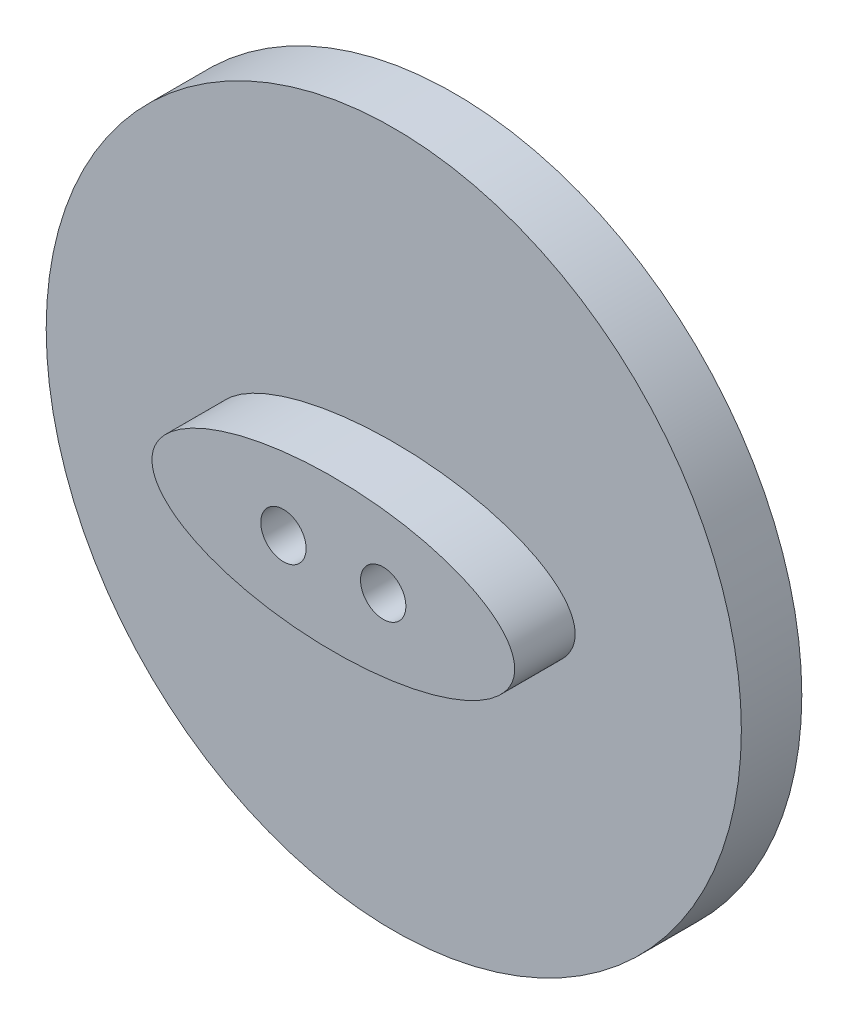
ISO-10303-21;
HEADER;
FILE_DESCRIPTION(('STEP AP214'),'2;1');
FILE_NAME('part.step','',(''),(''),'','','');
FILE_SCHEMA(('AUTOMOTIVE_DESIGN { 1 0 10303 214 1 1 1 1 }'));
ENDSEC;
DATA;
#1=APPLICATION_CONTEXT('core data for automotive mechanical design processes');
#2=APPLICATION_PROTOCOL_DEFINITION('international standard','automotive_design',2000,#1);
#3=PRODUCT_CONTEXT('',#1,'mechanical');
#4=PRODUCT('Part','Part','',(#3));
#5=PRODUCT_RELATED_PRODUCT_CATEGORY('part','',(#4));
#6=PRODUCT_DEFINITION_FORMATION('','',#4);
#7=PRODUCT_DEFINITION_CONTEXT('part definition',#1,'design');
#8=PRODUCT_DEFINITION('design','',#6,#7);
#9=PRODUCT_DEFINITION_SHAPE('','',#8);
#10=(LENGTH_UNIT() NAMED_UNIT(*) SI_UNIT(.MILLI.,.METRE.));
#11=(NAMED_UNIT(*) PLANE_ANGLE_UNIT() SI_UNIT($,.RADIAN.));
#12=(NAMED_UNIT(*) SI_UNIT($,.STERADIAN.) SOLID_ANGLE_UNIT());
#13=UNCERTAINTY_MEASURE_WITH_UNIT(LENGTH_MEASURE(1.E-05),#10,'distance_accuracy_value','');
#14=(GEOMETRIC_REPRESENTATION_CONTEXT(3) GLOBAL_UNCERTAINTY_ASSIGNED_CONTEXT((#13)) GLOBAL_UNIT_ASSIGNED_CONTEXT((#10,
#11,#12)) REPRESENTATION_CONTEXT('',''));
#15=CARTESIAN_POINT('',(0.,0.,0.));
#16=DIRECTION('',(0.,0.,1.));
#17=DIRECTION('',(1.,0.,0.));
#18=AXIS2_PLACEMENT_3D('',#15,#16,#17);
#19=CARTESIAN_POINT('',(0.,0.,2.));
#20=DIRECTION('',(0.,0.,-1.));
#21=DIRECTION('',(-1.,0.,0.));
#22=AXIS2_PLACEMENT_3D('',#19,#20,#21);
#23=CYLINDRICAL_SURFACE('',#22,11.5);
#24=CARTESIAN_POINT('',(0.,0.,2.));
#25=DIRECTION('',(0.,0.,1.));
#26=DIRECTION('',(1.,0.,0.));
#27=AXIS2_PLACEMENT_3D('',#24,#25,#26);
#28=CIRCLE('',#27,11.5);
#29=CARTESIAN_POINT('',(11.5,0.,2.));
#30=VERTEX_POINT('',#29);
#31=EDGE_CURVE('E45',#30,#30,#28,.T.);
#32=ORIENTED_EDGE('',*,*,#31,.F.);
#33=EDGE_LOOP('',(#32));
#34=FACE_BOUND('',#33,.T.);
#35=CARTESIAN_POINT('',(0.,0.,0.));
#36=DIRECTION('',(0.,0.,1.));
#37=DIRECTION('',(1.,0.,0.));
#38=AXIS2_PLACEMENT_3D('',#35,#36,#37);
#39=CIRCLE('',#38,11.5);
#40=CARTESIAN_POINT('',(11.5,0.,0.));
#41=VERTEX_POINT('',#40);
#42=EDGE_CURVE('E40',#41,#41,#39,.T.);
#43=ORIENTED_EDGE('',*,*,#42,.T.);
#44=EDGE_LOOP('',(#43));
#45=FACE_BOUND('',#44,.T.);
#46=ADVANCED_FACE('F37',(#34,#45),#23,.T.);
#47=CARTESIAN_POINT('',(0.,0.,2.));
#48=DIRECTION('',(0.,0.,1.));
#49=DIRECTION('',(1.,0.,0.));
#50=AXIS2_PLACEMENT_3D('',#47,#48,#49);
#51=PLANE('',#50);
#52=CARTESIAN_POINT('',(0.,0.,2.));
#53=DIRECTION('',(0.,0.,1.));
#54=DIRECTION('',(1.,0.,0.));
#55=AXIS2_PLACEMENT_3D('',#52,#53,#54);
#56=ELLIPSE('',#55,6.,2.5);
#57=CARTESIAN_POINT('',(6.,0.,2.));
#58=VERTEX_POINT('',#57);
#59=EDGE_CURVE('E10',#58,#58,#56,.T.);
#60=ORIENTED_EDGE('',*,*,#59,.F.);
#61=EDGE_LOOP('',(#60));
#62=FACE_BOUND('',#61,.T.);
#63=ORIENTED_EDGE('',*,*,#31,.T.);
#64=EDGE_LOOP('',(#63));
#65=FACE_BOUND('',#64,.T.);
#66=ADVANCED_FACE('F69',(#62,#65),#51,.T.);
#67=CARTESIAN_POINT('',(0.,0.,0.));
#68=DIRECTION('',(0.,0.,1.));
#69=DIRECTION('',(1.,0.,0.));
#70=AXIS2_PLACEMENT_3D('',#67,#68,#69);
#71=PLANE('',#70);
#72=CARTESIAN_POINT('',(-1.65046466574381,0.,0.));
#73=DIRECTION('',(0.,0.,-1.));
#74=DIRECTION('',(-1.,0.,0.));
#75=AXIS2_PLACEMENT_3D('',#72,#73,#74);
#76=CIRCLE('',#75,0.75);
#77=CARTESIAN_POINT('',(-2.40046466574381,0.,0.));
#78=VERTEX_POINT('',#77);
#79=EDGE_CURVE('E91',#78,#78,#76,.T.);
#80=ORIENTED_EDGE('',*,*,#79,.F.);
#81=EDGE_LOOP('',(#80));
#82=FACE_BOUND('',#81,.T.);
#83=CARTESIAN_POINT('',(1.65046466574381,0.,0.));
#84=DIRECTION('',(0.,0.,-1.));
#85=DIRECTION('',(-1.,0.,0.));
#86=AXIS2_PLACEMENT_3D('',#83,#84,#85);
#87=CIRCLE('',#86,0.75);
#88=CARTESIAN_POINT('',(0.900464665743811,0.,0.));
#89=VERTEX_POINT('',#88);
#90=EDGE_CURVE('E58',#89,#89,#87,.T.);
#91=ORIENTED_EDGE('',*,*,#90,.F.);
#92=EDGE_LOOP('',(#91));
#93=FACE_BOUND('',#92,.T.);
#94=ORIENTED_EDGE('',*,*,#42,.F.);
#95=EDGE_LOOP('',(#94));
#96=FACE_BOUND('',#95,.T.);
#97=ADVANCED_FACE('F66',(#82,#93,#96),#71,.F.);
#98=CARTESIAN_POINT('',(0.,0.,4.));
#99=DIRECTION('',(0.,0.,1.));
#100=DIRECTION('',(1.,0.,0.));
#101=AXIS2_PLACEMENT_3D('',#98,#99,#100);
#102=ELLIPSE('',#101,6.,2.5);
#103=DIRECTION('',(0.,0.,-1.));
#104=VECTOR('',#103,1.);
#105=SURFACE_OF_LINEAR_EXTRUSION('',#102,#104);
#106=CARTESIAN_POINT('',(6.,0.,4.));
#107=VERTEX_POINT('',#106);
#108=EDGE_CURVE('E52',#107,#107,#102,.T.);
#109=ORIENTED_EDGE('',*,*,#108,.F.);
#110=EDGE_LOOP('',(#109));
#111=FACE_BOUND('',#110,.T.);
#112=ORIENTED_EDGE('',*,*,#59,.T.);
#113=EDGE_LOOP('',(#112));
#114=FACE_BOUND('',#113,.T.);
#115=ADVANCED_FACE('F61',(#111,#114),#105,.F.);
#116=CARTESIAN_POINT('',(0.,0.,4.));
#117=DIRECTION('',(0.,0.,1.));
#118=DIRECTION('',(1.,0.,0.));
#119=AXIS2_PLACEMENT_3D('',#116,#117,#118);
#120=PLANE('',#119);
#121=CARTESIAN_POINT('',(-1.65046466574381,0.,4.));
#122=DIRECTION('',(0.,0.,-1.));
#123=DIRECTION('',(-1.,0.,0.));
#124=AXIS2_PLACEMENT_3D('',#121,#122,#123);
#125=CIRCLE('',#124,0.75);
#126=CARTESIAN_POINT('',(-2.40046466574381,0.,4.));
#127=VERTEX_POINT('',#126);
#128=EDGE_CURVE('E57',#127,#127,#125,.T.);
#129=ORIENTED_EDGE('',*,*,#128,.T.);
#130=EDGE_LOOP('',(#129));
#131=FACE_BOUND('',#130,.T.);
#132=CARTESIAN_POINT('',(1.65046466574381,0.,4.));
#133=DIRECTION('',(0.,0.,-1.));
#134=DIRECTION('',(-1.,0.,0.));
#135=AXIS2_PLACEMENT_3D('',#132,#133,#134);
#136=CIRCLE('',#135,0.75);
#137=CARTESIAN_POINT('',(0.900464665743811,0.,4.));
#138=VERTEX_POINT('',#137);
#139=EDGE_CURVE('E95',#138,#138,#136,.T.);
#140=ORIENTED_EDGE('',*,*,#139,.T.);
#141=EDGE_LOOP('',(#140));
#142=FACE_BOUND('',#141,.T.);
#143=ORIENTED_EDGE('',*,*,#108,.T.);
#144=EDGE_LOOP('',(#143));
#145=FACE_BOUND('',#144,.T.);
#146=ADVANCED_FACE('F65',(#131,#142,#145),#120,.T.);
#147=CARTESIAN_POINT('',(1.65046466574381,0.,4.));
#148=DIRECTION('',(0.,0.,-1.));
#149=DIRECTION('',(-1.,0.,0.));
#150=AXIS2_PLACEMENT_3D('',#147,#148,#149);
#151=CYLINDRICAL_SURFACE('',#150,0.75);
#152=ORIENTED_EDGE('',*,*,#139,.F.);
#153=EDGE_LOOP('',(#152));
#154=FACE_BOUND('',#153,.T.);
#155=ORIENTED_EDGE('',*,*,#90,.T.);
#156=EDGE_LOOP('',(#155));
#157=FACE_BOUND('',#156,.T.);
#158=ADVANCED_FACE('F102',(#154,#157),#151,.F.);
#159=CARTESIAN_POINT('',(-1.65046466574381,0.,4.));
#160=DIRECTION('',(0.,0.,-1.));
#161=DIRECTION('',(-1.,0.,0.));
#162=AXIS2_PLACEMENT_3D('',#159,#160,#161);
#163=CYLINDRICAL_SURFACE('',#162,0.75);
#164=ORIENTED_EDGE('',*,*,#128,.F.);
#165=EDGE_LOOP('',(#164));
#166=FACE_BOUND('',#165,.T.);
#167=ORIENTED_EDGE('',*,*,#79,.T.);
#168=EDGE_LOOP('',(#167));
#169=FACE_BOUND('',#168,.T.);
#170=ADVANCED_FACE('F104',(#166,#169),#163,.F.);
#171=CLOSED_SHELL('',(#46,#66,#97,#115,#146,#158,#170));
#172=MANIFOLD_SOLID_BREP('B2',#171);
#173=ADVANCED_BREP_SHAPE_REPRESENTATION('',(#18,#172),#14);
#174=SHAPE_DEFINITION_REPRESENTATION(#9,#173);
ENDSEC;
END-ISO-10303-21;
